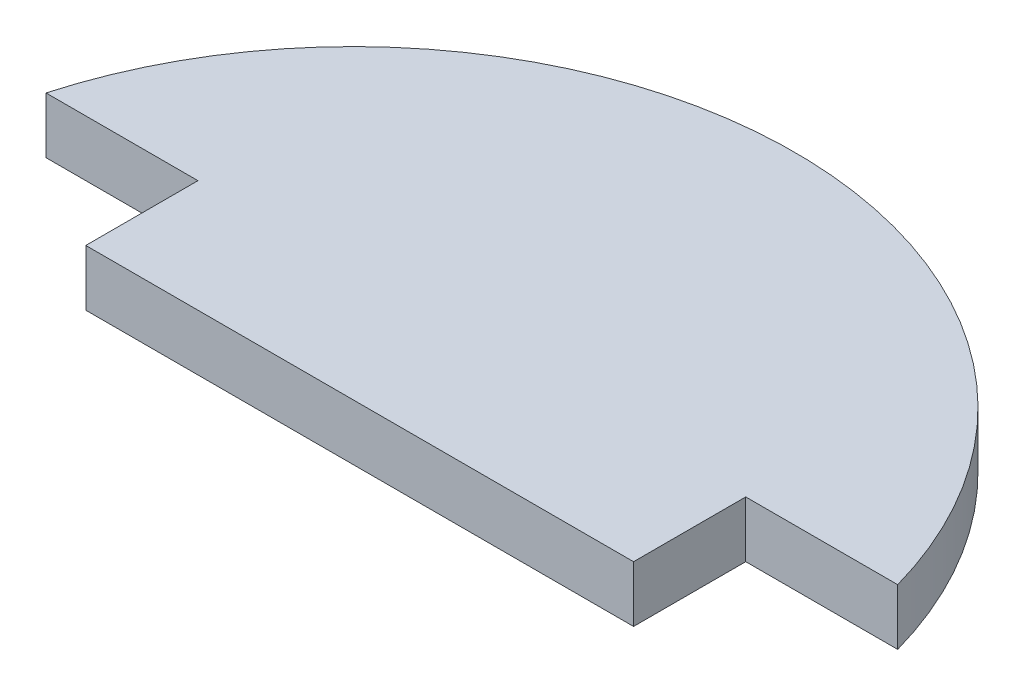
ISO-10303-21;
HEADER;
FILE_DESCRIPTION(('STEP AP214'),'2;1');
FILE_NAME('part.step','',(''),(''),'','','');
FILE_SCHEMA(('AUTOMOTIVE_DESIGN { 1 0 10303 214 1 1 1 1 }'));
ENDSEC;
DATA;
#1=APPLICATION_CONTEXT('core data for automotive mechanical design processes');
#2=APPLICATION_PROTOCOL_DEFINITION('international standard','automotive_design',2000,#1);
#3=PRODUCT_CONTEXT('',#1,'mechanical');
#4=PRODUCT('Part','Part','',(#3));
#5=PRODUCT_RELATED_PRODUCT_CATEGORY('part','',(#4));
#6=PRODUCT_DEFINITION_FORMATION('','',#4);
#7=PRODUCT_DEFINITION_CONTEXT('part definition',#1,'design');
#8=PRODUCT_DEFINITION('design','',#6,#7);
#9=PRODUCT_DEFINITION_SHAPE('','',#8);
#10=(LENGTH_UNIT() NAMED_UNIT(*) SI_UNIT(.MILLI.,.METRE.));
#11=(NAMED_UNIT(*) PLANE_ANGLE_UNIT() SI_UNIT($,.RADIAN.));
#12=(NAMED_UNIT(*) SI_UNIT($,.STERADIAN.) SOLID_ANGLE_UNIT());
#13=UNCERTAINTY_MEASURE_WITH_UNIT(LENGTH_MEASURE(1.E-05),#10,'distance_accuracy_value','');
#14=(GEOMETRIC_REPRESENTATION_CONTEXT(3) GLOBAL_UNCERTAINTY_ASSIGNED_CONTEXT((#13)) GLOBAL_UNIT_ASSIGNED_CONTEXT((#10,
#11,#12)) REPRESENTATION_CONTEXT('',''));
#15=CARTESIAN_POINT('',(0.,0.,0.));
#16=DIRECTION('',(0.,0.,1.));
#17=DIRECTION('',(1.,0.,0.));
#18=AXIS2_PLACEMENT_3D('',#15,#16,#17);
#19=CARTESIAN_POINT('',(-2.57054347826088,5.,0.627833576674897));
#20=DIRECTION('',(0.,-1.,0.));
#21=DIRECTION('',(0.,0.,-1.));
#22=AXIS2_PLACEMENT_3D('',#19,#20,#21);
#23=CYLINDRICAL_SURFACE('',#22,39.42);
#24=CARTESIAN_POINT('',(-2.57054347826088,0.,0.627833576674897));
#25=DIRECTION('',(0.,1.,0.));
#26=DIRECTION('',(0.,0.,1.));
#27=AXIS2_PLACEMENT_3D('',#24,#25,#26);
#28=CIRCLE('',#27,39.42);
#29=CARTESIAN_POINT('',(-40.5308589862556,0.,-10.));
#30=VERTEX_POINT('',#29);
#31=CARTESIAN_POINT('',(35.3897720297338,0.,-10.));
#32=VERTEX_POINT('',#31);
#33=EDGE_CURVE('E125',#30,#32,#28,.F.);
#34=ORIENTED_EDGE('',*,*,#33,.F.);
#35=DIRECTION('',(0.,-1.,0.));
#36=VECTOR('',#35,1.);
#37=CARTESIAN_POINT('',(-40.5308589862556,5.,-10.));
#38=LINE('',#37,#36);
#39=CARTESIAN_POINT('',(-40.5308589862556,5.,-10.));
#40=VERTEX_POINT('',#39);
#41=EDGE_CURVE('E11',#40,#30,#38,.T.);
#42=ORIENTED_EDGE('',*,*,#41,.F.);
#43=CARTESIAN_POINT('',(-2.57054347826088,5.,0.627833576674897));
#44=DIRECTION('',(0.,1.,0.));
#45=DIRECTION('',(0.,0.,1.));
#46=AXIS2_PLACEMENT_3D('',#43,#44,#45);
#47=CIRCLE('',#46,39.42);
#48=CARTESIAN_POINT('',(35.3897720297338,5.,-10.));
#49=VERTEX_POINT('',#48);
#50=EDGE_CURVE('E143',#40,#49,#47,.F.);
#51=ORIENTED_EDGE('',*,*,#50,.T.);
#52=DIRECTION('',(0.,-1.,0.));
#53=VECTOR('',#52,1.);
#54=CARTESIAN_POINT('',(35.3897720297338,5.,-10.));
#55=LINE('',#54,#53);
#56=EDGE_CURVE('E85',#49,#32,#55,.T.);
#57=ORIENTED_EDGE('',*,*,#56,.T.);
#58=EDGE_LOOP('',(#34,#42,#51,#57));
#59=FACE_BOUND('',#58,.T.);
#60=ADVANCED_FACE('F39',(#59),#23,.T.);
#61=CARTESIAN_POINT('',(0.,5.,-10.));
#62=DIRECTION('',(0.,0.,1.));
#63=DIRECTION('',(1.,0.,0.));
#64=AXIS2_PLACEMENT_3D('',#61,#62,#63);
#65=PLANE('',#64);
#66=DIRECTION('',(-1.,0.,0.));
#67=VECTOR('',#66,1.);
#68=CARTESIAN_POINT('',(0.,0.,-10.));
#69=LINE('',#68,#67);
#70=CARTESIAN_POINT('',(-26.9855434782609,0.,-10.));
#71=VERTEX_POINT('',#70);
#72=EDGE_CURVE('E129',#71,#30,#69,.T.);
#73=ORIENTED_EDGE('',*,*,#72,.F.);
#74=DIRECTION('',(0.,-1.,0.));
#75=VECTOR('',#74,1.);
#76=CARTESIAN_POINT('',(-26.9855434782609,5.,-10.));
#77=LINE('',#76,#75);
#78=CARTESIAN_POINT('',(-26.9855434782609,5.,-10.));
#79=VERTEX_POINT('',#78);
#80=EDGE_CURVE('E48',#79,#71,#77,.T.);
#81=ORIENTED_EDGE('',*,*,#80,.F.);
#82=DIRECTION('',(-1.,0.,0.));
#83=VECTOR('',#82,1.);
#84=CARTESIAN_POINT('',(0.,5.,-10.));
#85=LINE('',#84,#83);
#86=EDGE_CURVE('E159',#79,#40,#85,.T.);
#87=ORIENTED_EDGE('',*,*,#86,.T.);
#88=ORIENTED_EDGE('',*,*,#41,.T.);
#89=EDGE_LOOP('',(#73,#81,#87,#88));
#90=FACE_BOUND('',#89,.T.);
#91=ADVANCED_FACE('F158',(#90),#65,.T.);
#92=CARTESIAN_POINT('',(-26.9855434782609,5.,0.));
#93=DIRECTION('',(1.,0.,0.));
#94=DIRECTION('',(0.,0.,-1.));
#95=AXIS2_PLACEMENT_3D('',#92,#93,#94);
#96=PLANE('',#95);
#97=DIRECTION('',(0.,0.,1.));
#98=VECTOR('',#97,1.);
#99=CARTESIAN_POINT('',(-26.9855434782609,0.,0.));
#100=LINE('',#99,#98);
#101=CARTESIAN_POINT('',(-26.9855434782609,0.,0.));
#102=VERTEX_POINT('',#101);
#103=EDGE_CURVE('E133',#71,#102,#100,.T.);
#104=ORIENTED_EDGE('',*,*,#103,.T.);
#105=DIRECTION('',(0.,-1.,0.));
#106=VECTOR('',#105,1.);
#107=CARTESIAN_POINT('',(-26.9855434782609,5.,0.));
#108=LINE('',#107,#106);
#109=CARTESIAN_POINT('',(-26.9855434782609,5.,0.));
#110=VERTEX_POINT('',#109);
#111=EDGE_CURVE('E115',#110,#102,#108,.T.);
#112=ORIENTED_EDGE('',*,*,#111,.F.);
#113=DIRECTION('',(0.,0.,1.));
#114=VECTOR('',#113,1.);
#115=CARTESIAN_POINT('',(-26.9855434782609,5.,0.));
#116=LINE('',#115,#114);
#117=EDGE_CURVE('E104',#79,#110,#116,.T.);
#118=ORIENTED_EDGE('',*,*,#117,.F.);
#119=ORIENTED_EDGE('',*,*,#80,.T.);
#120=EDGE_LOOP('',(#104,#112,#118,#119));
#121=FACE_BOUND('',#120,.T.);
#122=ADVANCED_FACE('F152',(#121),#96,.F.);
#123=CARTESIAN_POINT('',(0.,5.,0.));
#124=DIRECTION('',(0.,0.,-1.));
#125=DIRECTION('',(-1.,0.,0.));
#126=AXIS2_PLACEMENT_3D('',#123,#124,#125);
#127=PLANE('',#126);
#128=DIRECTION('',(1.,0.,0.));
#129=VECTOR('',#128,1.);
#130=CARTESIAN_POINT('',(0.,0.,0.));
#131=LINE('',#130,#129);
#132=CARTESIAN_POINT('',(21.8444565217391,0.,0.));
#133=VERTEX_POINT('',#132);
#134=EDGE_CURVE('E113',#102,#133,#131,.T.);
#135=ORIENTED_EDGE('',*,*,#134,.T.);
#136=DIRECTION('',(0.,-1.,0.));
#137=VECTOR('',#136,1.);
#138=CARTESIAN_POINT('',(21.8444565217391,5.,0.));
#139=LINE('',#138,#137);
#140=CARTESIAN_POINT('',(21.8444565217391,5.,0.));
#141=VERTEX_POINT('',#140);
#142=EDGE_CURVE('E110',#141,#133,#139,.T.);
#143=ORIENTED_EDGE('',*,*,#142,.F.);
#144=DIRECTION('',(1.,0.,0.));
#145=VECTOR('',#144,1.);
#146=CARTESIAN_POINT('',(0.,5.,0.));
#147=LINE('',#146,#145);
#148=EDGE_CURVE('E97',#110,#141,#147,.T.);
#149=ORIENTED_EDGE('',*,*,#148,.F.);
#150=ORIENTED_EDGE('',*,*,#111,.T.);
#151=EDGE_LOOP('',(#135,#143,#149,#150));
#152=FACE_BOUND('',#151,.T.);
#153=ADVANCED_FACE('F111',(#152),#127,.F.);
#154=CARTESIAN_POINT('',(21.8444565217391,5.,0.));
#155=DIRECTION('',(-1.,0.,0.));
#156=DIRECTION('',(0.,0.,1.));
#157=AXIS2_PLACEMENT_3D('',#154,#155,#156);
#158=PLANE('',#157);
#159=DIRECTION('',(0.,0.,-1.));
#160=VECTOR('',#159,1.);
#161=CARTESIAN_POINT('',(21.8444565217391,0.,0.));
#162=LINE('',#161,#160);
#163=CARTESIAN_POINT('',(21.8444565217391,0.,-10.));
#164=VERTEX_POINT('',#163);
#165=EDGE_CURVE('E78',#133,#164,#162,.T.);
#166=ORIENTED_EDGE('',*,*,#165,.T.);
#167=DIRECTION('',(0.,-1.,0.));
#168=VECTOR('',#167,1.);
#169=CARTESIAN_POINT('',(21.8444565217391,5.,-10.));
#170=LINE('',#169,#168);
#171=CARTESIAN_POINT('',(21.8444565217391,5.,-10.));
#172=VERTEX_POINT('',#171);
#173=EDGE_CURVE('E116',#172,#164,#170,.T.);
#174=ORIENTED_EDGE('',*,*,#173,.F.);
#175=DIRECTION('',(0.,0.,-1.));
#176=VECTOR('',#175,1.);
#177=CARTESIAN_POINT('',(21.8444565217391,5.,0.));
#178=LINE('',#177,#176);
#179=EDGE_CURVE('E101',#141,#172,#178,.T.);
#180=ORIENTED_EDGE('',*,*,#179,.F.);
#181=ORIENTED_EDGE('',*,*,#142,.T.);
#182=EDGE_LOOP('',(#166,#174,#180,#181));
#183=FACE_BOUND('',#182,.T.);
#184=ADVANCED_FACE('F118',(#183),#158,.F.);
#185=CARTESIAN_POINT('',(0.,5.,-10.));
#186=DIRECTION('',(0.,0.,-1.));
#187=DIRECTION('',(-1.,0.,0.));
#188=AXIS2_PLACEMENT_3D('',#185,#186,#187);
#189=PLANE('',#188);
#190=DIRECTION('',(1.,0.,0.));
#191=VECTOR('',#190,1.);
#192=CARTESIAN_POINT('',(0.,0.,-10.));
#193=LINE('',#192,#191);
#194=EDGE_CURVE('E140',#164,#32,#193,.T.);
#195=ORIENTED_EDGE('',*,*,#194,.T.);
#196=ORIENTED_EDGE('',*,*,#56,.F.);
#197=DIRECTION('',(1.,0.,0.));
#198=VECTOR('',#197,1.);
#199=CARTESIAN_POINT('',(0.,5.,-10.));
#200=LINE('',#199,#198);
#201=EDGE_CURVE('E56',#172,#49,#200,.T.);
#202=ORIENTED_EDGE('',*,*,#201,.F.);
#203=ORIENTED_EDGE('',*,*,#173,.T.);
#204=EDGE_LOOP('',(#195,#196,#202,#203));
#205=FACE_BOUND('',#204,.T.);
#206=ADVANCED_FACE('F162',(#205),#189,.F.);
#207=CARTESIAN_POINT('',(0.,5.,0.));
#208=DIRECTION('',(0.,1.,0.));
#209=DIRECTION('',(0.,0.,1.));
#210=AXIS2_PLACEMENT_3D('',#207,#208,#209);
#211=PLANE('',#210);
#212=ORIENTED_EDGE('',*,*,#50,.F.);
#213=ORIENTED_EDGE('',*,*,#86,.F.);
#214=ORIENTED_EDGE('',*,*,#117,.T.);
#215=ORIENTED_EDGE('',*,*,#148,.T.);
#216=ORIENTED_EDGE('',*,*,#179,.T.);
#217=ORIENTED_EDGE('',*,*,#201,.T.);
#218=EDGE_LOOP('',(#212,#213,#214,#215,#216,#217));
#219=FACE_BOUND('',#218,.T.);
#220=ADVANCED_FACE('F99',(#219),#211,.T.);
#221=CARTESIAN_POINT('',(0.,0.,0.));
#222=DIRECTION('',(0.,1.,0.));
#223=DIRECTION('',(0.,0.,1.));
#224=AXIS2_PLACEMENT_3D('',#221,#222,#223);
#225=PLANE('',#224);
#226=ORIENTED_EDGE('',*,*,#33,.T.);
#227=ORIENTED_EDGE('',*,*,#194,.F.);
#228=ORIENTED_EDGE('',*,*,#165,.F.);
#229=ORIENTED_EDGE('',*,*,#134,.F.);
#230=ORIENTED_EDGE('',*,*,#103,.F.);
#231=ORIENTED_EDGE('',*,*,#72,.T.);
#232=EDGE_LOOP('',(#226,#227,#228,#229,#230,#231));
#233=FACE_BOUND('',#232,.T.);
#234=ADVANCED_FACE('F157',(#233),#225,.F.);
#235=CLOSED_SHELL('',(#60,#91,#122,#153,#184,#206,#220,#234));
#236=MANIFOLD_SOLID_BREP('B2',#235);
#237=ADVANCED_BREP_SHAPE_REPRESENTATION('',(#18,#236),#14);
#238=SHAPE_DEFINITION_REPRESENTATION(#9,#237);
ENDSEC;
END-ISO-10303-21;
